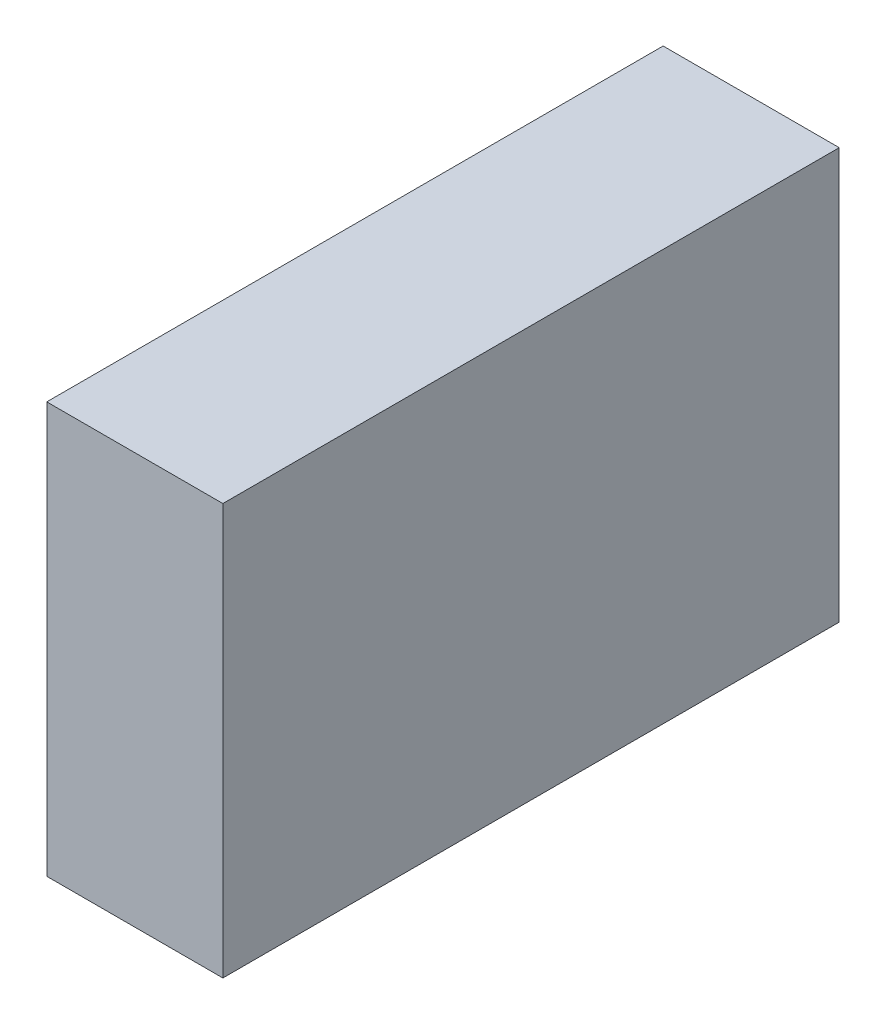
ISO-10303-21;
HEADER;
FILE_DESCRIPTION(('STEP AP214'),'2;1');
FILE_NAME('part.step','',(''),(''),'','','');
FILE_SCHEMA(('AUTOMOTIVE_DESIGN { 1 0 10303 214 1 1 1 1 }'));
ENDSEC;
DATA;
#1=APPLICATION_CONTEXT('core data for automotive mechanical design processes');
#2=APPLICATION_PROTOCOL_DEFINITION('international standard','automotive_design',2000,#1);
#3=PRODUCT_CONTEXT('',#1,'mechanical');
#4=PRODUCT('Part','Part','',(#3));
#5=PRODUCT_RELATED_PRODUCT_CATEGORY('part','',(#4));
#6=PRODUCT_DEFINITION_FORMATION('','',#4);
#7=PRODUCT_DEFINITION_CONTEXT('part definition',#1,'design');
#8=PRODUCT_DEFINITION('design','',#6,#7);
#9=PRODUCT_DEFINITION_SHAPE('','',#8);
#10=(LENGTH_UNIT() NAMED_UNIT(*) SI_UNIT(.MILLI.,.METRE.));
#11=(NAMED_UNIT(*) PLANE_ANGLE_UNIT() SI_UNIT($,.RADIAN.));
#12=(NAMED_UNIT(*) SI_UNIT($,.STERADIAN.) SOLID_ANGLE_UNIT());
#13=UNCERTAINTY_MEASURE_WITH_UNIT(LENGTH_MEASURE(1.E-05),#10,'distance_accuracy_value','');
#14=(GEOMETRIC_REPRESENTATION_CONTEXT(3) GLOBAL_UNCERTAINTY_ASSIGNED_CONTEXT((#13)) GLOBAL_UNIT_ASSIGNED_CONTEXT((#10,
#11,#12)) REPRESENTATION_CONTEXT('',''));
#15=CARTESIAN_POINT('',(0.,0.,0.));
#16=DIRECTION('',(0.,0.,1.));
#17=DIRECTION('',(1.,0.,0.));
#18=AXIS2_PLACEMENT_3D('',#15,#16,#17);
#19=CARTESIAN_POINT('',(0.,0.,95.));
#20=DIRECTION('',(0.,0.,-1.));
#21=DIRECTION('',(-1.,0.,0.));
#22=AXIS2_PLACEMENT_3D('',#19,#20,#21);
#23=PLANE('',#22);
#24=DIRECTION('',(0.,1.,0.));
#25=VECTOR('',#24,1.);
#26=CARTESIAN_POINT('',(0.,0.,95.));
#27=LINE('',#26,#25);
#28=CARTESIAN_POINT('',(0.,0.0749999999999983,95.));
#29=VERTEX_POINT('',#28);
#30=CARTESIAN_POINT('',(0.,-0.0749999999999976,95.));
#31=VERTEX_POINT('',#30);
#32=EDGE_CURVE('E125',#29,#31,#27,.F.);
#33=ORIENTED_EDGE('',*,*,#32,.F.);
#34=CARTESIAN_POINT('',(0.,0.,95.));
#35=DIRECTION('',(0.,0.,-1.));
#36=DIRECTION('',(-1.,0.,0.));
#37=AXIS2_PLACEMENT_3D('',#34,#35,#36);
#38=CIRCLE('',#37,0.0749999999999983);
#39=EDGE_CURVE('E21',#31,#29,#38,.F.);
#40=ORIENTED_EDGE('',*,*,#39,.F.);
#41=EDGE_LOOP('',(#33,#40));
#42=FACE_BOUND('',#41,.T.);
#43=ADVANCED_FACE('F17',(#42),#23,.T.);
#44=CARTESIAN_POINT('',(0.,0.,85.1));
#45=DIRECTION('',(0.,0.,-1.));
#46=DIRECTION('',(-1.,0.,0.));
#47=AXIS2_PLACEMENT_3D('',#44,#45,#46);
#48=DEGENERATE_TOROIDAL_SURFACE('',#47,0.0749999999999977,9.90000000000001,.T.);
#49=CARTESIAN_POINT('',(0.,0.074999999999998,85.1));
#50=DIRECTION('',(-1.,0.,0.));
#51=DIRECTION('',(0.,-1.,0.));
#52=AXIS2_PLACEMENT_3D('',#49,#50,#51);
#53=CIRCLE('',#52,9.90000000000001);
#54=CARTESIAN_POINT('',(0.,9.57900000000001,87.872));
#55=VERTEX_POINT('',#54);
#56=EDGE_CURVE('E119',#55,#29,#53,.F.);
#57=ORIENTED_EDGE('',*,*,#56,.F.);
#58=CARTESIAN_POINT('',(0.,0.,87.872));
#59=DIRECTION('',(0.,0.,-1.));
#60=DIRECTION('',(1.,0.,0.));
#61=AXIS2_PLACEMENT_3D('',#58,#59,#60);
#62=CIRCLE('',#61,9.579);
#63=CARTESIAN_POINT('',(0.,-9.579,87.872));
#64=VERTEX_POINT('',#63);
#65=EDGE_CURVE('E124',#55,#64,#62,.T.);
#66=ORIENTED_EDGE('',*,*,#65,.T.);
#67=CARTESIAN_POINT('',(0.,-0.0749999999999973,85.1));
#68=DIRECTION('',(1.,0.,0.));
#69=DIRECTION('',(0.,1.,0.));
#70=AXIS2_PLACEMENT_3D('',#67,#68,#69);
#71=CIRCLE('',#70,9.90000000000001);
#72=EDGE_CURVE('E122',#31,#64,#71,.T.);
#73=ORIENTED_EDGE('',*,*,#72,.F.);
#74=ORIENTED_EDGE('',*,*,#39,.T.);
#75=EDGE_LOOP('',(#57,#66,#73,#74));
#76=FACE_BOUND('',#75,.T.);
#77=ADVANCED_FACE('F117',(#76),#48,.F.);
#78=CARTESIAN_POINT('',(0.,0.,46.7451428115925));
#79=DIRECTION('',(0.,0.,-1.));
#80=DIRECTION('',(-1.,0.,0.));
#81=AXIS2_PLACEMENT_3D('',#78,#79,#80);
#82=CONICAL_SURFACE('',#81,21.5743333466189,0.283794109208328);
#83=ORIENTED_EDGE('',*,*,#65,.F.);
#84=DIRECTION('',(0.,-0.279999999999999,0.960000000000001));
#85=VECTOR('',#84,1.);
#86=CARTESIAN_POINT('',(0.,21.5743333466188,46.7451428115925));
#87=LINE('',#86,#85);
#88=CARTESIAN_POINT('',(0.,21.5743333466188,46.7451428115925));
#89=VERTEX_POINT('',#88);
#90=EDGE_CURVE('E132',#89,#55,#87,.T.);
#91=ORIENTED_EDGE('',*,*,#90,.F.);
#92=CARTESIAN_POINT('',(0.,0.,46.7451428115925));
#93=DIRECTION('',(0.,0.,-1.));
#94=DIRECTION('',(1.,0.,0.));
#95=AXIS2_PLACEMENT_3D('',#92,#93,#94);
#96=CIRCLE('',#95,21.5743333466188);
#97=CARTESIAN_POINT('',(0.,-21.5743333466188,46.7451428115925));
#98=VERTEX_POINT('',#97);
#99=EDGE_CURVE('E458',#89,#98,#96,.T.);
#100=ORIENTED_EDGE('',*,*,#99,.T.);
#101=DIRECTION('',(0.,-0.279999999999999,-0.960000000000001));
#102=VECTOR('',#101,1.);
#103=CARTESIAN_POINT('',(0.,-9.579,87.872));
#104=LINE('',#103,#102);
#105=EDGE_CURVE('E321',#64,#98,#104,.T.);
#106=ORIENTED_EDGE('',*,*,#105,.F.);
#107=EDGE_LOOP('',(#83,#91,#100,#106));
#108=FACE_BOUND('',#107,.T.);
#109=ADVANCED_FACE('F244',(#108),#82,.F.);
#110=CARTESIAN_POINT('',(0.,0.,43.9451428115925));
#111=DIRECTION('',(0.,0.,-1.));
#112=DIRECTION('',(1.,0.,0.));
#113=AXIS2_PLACEMENT_3D('',#110,#111,#112);
#114=TOROIDAL_SURFACE('',#113,11.9743333466188,10.);
#115=ORIENTED_EDGE('',*,*,#99,.F.);
#116=CARTESIAN_POINT('',(0.,15.6581111155396,34.6483809371975));
#117=CARTESIAN_POINT('',(0.,15.9195968283825,34.7519603203659));
#118=CARTESIAN_POINT('',(0.,16.1766856918784,34.8666242387304));
#119=CARTESIAN_POINT('',(0.,16.680287629009,35.1171800705973));
#120=CARTESIAN_POINT('',(0.,16.9268012082155,35.2530709678586));
#121=CARTESIAN_POINT('',(0.,17.4073265189603,35.5450468849546));
#122=CARTESIAN_POINT('',(0.,17.641346936224,35.7011176097067));
#123=CARTESIAN_POINT('',(0.,18.095411747219,36.0324082136067));
#124=CARTESIAN_POINT('',(0.,18.3154563115301,36.2076278589646));
#125=CARTESIAN_POINT('',(0.,18.7401109929584,36.5760646212188));
#126=CARTESIAN_POINT('',(0.,18.9447135871878,36.7692904090625));
#127=CARTESIAN_POINT('',(0.,19.3369159398995,37.1722971959028));
#128=CARTESIAN_POINT('',(0.,19.5245153391076,37.3820785445399));
#129=CARTESIAN_POINT('',(0.,19.8813277852951,37.8166470176979));
#130=CARTESIAN_POINT('',(0.,20.0505454042209,38.0414303883333));
#131=CARTESIAN_POINT('',(0.,20.3694442508555,38.5044504515763));
#132=CARTESIAN_POINT('',(0.,20.5191256000658,38.7426870605012));
#133=CARTESIAN_POINT('',(0.,20.7978777158438,39.2309013825695));
#134=CARTESIAN_POINT('',(0.,20.9269501843811,39.4808781239536));
#135=CARTESIAN_POINT('',(0.,21.1635822458065,39.9908145299473));
#136=CARTESIAN_POINT('',(0.,21.2711418342081,40.250774196639));
#137=CARTESIAN_POINT('',(0.,21.4640249409851,40.7789418667299));
#138=CARTESIAN_POINT('',(0.,21.5493389459349,41.0471533444159));
#139=CARTESIAN_POINT('',(0.,21.697061752905,41.589803596011));
#140=CARTESIAN_POINT('',(0.,21.7594711894468,41.8642421971874));
#141=CARTESIAN_POINT('',(0.,21.8609700455238,42.4175414653477));
#142=CARTESIAN_POINT('',(0.,21.9000476740209,42.6964042952226));
#143=CARTESIAN_POINT('',(0.,21.9545544733446,43.256425858476));
#144=CARTESIAN_POINT('',(0.,21.9699842336994,43.5375845344447));
#145=CARTESIAN_POINT('',(0.,21.9770843989937,44.0998771222639));
#146=CARTESIAN_POINT('',(0.,21.968781796845,44.3810106988376));
#147=CARTESIAN_POINT('',(0.,21.9285391473477,44.9414737936074));
#148=CARTESIAN_POINT('',(0.,21.8966095235859,45.2208040525773));
#149=CARTESIAN_POINT('',(0.,21.8198629467652,45.7089580803511));
#150=CARTESIAN_POINT('',(0.,21.7799958093889,45.9185739965827));
#151=CARTESIAN_POINT('',(0.,21.6870305237953,46.3344672905062));
#152=CARTESIAN_POINT('',(0.,21.6339555507114,46.5407498489578));
#153=CARTESIAN_POINT('',(0.,21.5743333466188,46.7451428115925));
#154=B_SPLINE_CURVE_WITH_KNOTS('',3,(#116,#117,#118,#119,#120,#121,#122,#123,#124,#125,#126,
#127,#128,#129,#130,#131,#132,#133,#134,#135,#136,#137,#138,#139,#140,#141,#142,#143,#144,#145,
#146,#147,#148,#149,#150,#151,#152,#153),.UNSPECIFIED.,.F.,.F.,(4,2,2,2,2,2,2,2,2,2,2,2,2,2,2,2,
2,2,4),(0.,0.843502608802614,1.68696484730751,2.52983283034858,3.37269052393501,
4.21595621820343,5.05923972635237,5.90231300907248,6.74538104823216,7.58837942717383,
8.43137798192628,9.27473645978017,10.118071572445,10.9618325157312,11.8055724241862,
12.6483530547151,13.4907620953032,14.130464540875,14.7690523504703),.UNSPECIFIED.);
#155=CARTESIAN_POINT('',(0.,15.6581111155396,34.6483809371975));
#156=VERTEX_POINT('',#155);
#157=EDGE_CURVE('E134',#156,#89,#154,.T.);
#158=ORIENTED_EDGE('',*,*,#157,.F.);
#159=CARTESIAN_POINT('',(0.,0.,34.6483809371975));
#160=DIRECTION('',(0.,0.,1.));
#161=DIRECTION('',(1.,0.,0.));
#162=AXIS2_PLACEMENT_3D('',#159,#160,#161);
#163=CIRCLE('',#162,15.6581111155396);
#164=CARTESIAN_POINT('',(0.,-15.6581111155396,34.6483809371975));
#165=VERTEX_POINT('',#164);
#166=EDGE_CURVE('E230',#165,#156,#163,.T.);
#167=ORIENTED_EDGE('',*,*,#166,.F.);
#168=CARTESIAN_POINT('',(0.,-21.5743333466188,46.7451428115925));
#169=CARTESIAN_POINT('',(0.,-21.6531133239588,46.4751480305155));
#170=CARTESIAN_POINT('',(0.,-21.7204443425734,46.2018185007522));
#171=CARTESIAN_POINT('',(0.,-21.8318571754244,45.6504744007199));
#172=CARTESIAN_POINT('',(0.,-21.8759401022207,45.3724600553046));
#173=CARTESIAN_POINT('',(0.,-21.9404903248421,44.8139013930407));
#174=CARTESIAN_POINT('',(0.,-21.960974237014,44.5333589966671));
#175=CARTESIAN_POINT('',(0.,-21.978246195864,43.9715494237211));
#176=CARTESIAN_POINT('',(0.,-21.9750345318102,43.6902822560385));
#177=CARTESIAN_POINT('',(0.,-21.9449290093063,43.1288814155028));
#178=CARTESIAN_POINT('',(0.,-21.9180236878094,42.8487483572459));
#179=CARTESIAN_POINT('',(0.,-21.8407063737951,42.2917392113017));
#180=CARTESIAN_POINT('',(0.,-21.7902938847142,42.0148631925426));
#181=CARTESIAN_POINT('',(0.,-21.6663358592682,41.4664114740251));
#182=CARTESIAN_POINT('',(0.,-21.5927960929636,41.1948344701367));
#183=CARTESIAN_POINT('',(0.,-21.4231028635258,40.658841689184));
#184=CARTESIAN_POINT('',(0.,-21.3269495410431,40.3944258675904));
#185=CARTESIAN_POINT('',(0.,-21.1127212249961,39.8746545766105));
#186=CARTESIAN_POINT('',(0.,-20.994648043411,39.6192983603993));
#187=CARTESIAN_POINT('',(0.,-20.7374138530614,39.1194379379137));
#188=CARTESIAN_POINT('',(0.,-20.5982528398989,38.8749337339026));
#189=CARTESIAN_POINT('',(0.,-20.2997681641159,38.3984131373572));
#190=CARTESIAN_POINT('',(0.,-20.1404359183036,38.1664021211371));
#191=CARTESIAN_POINT('',(0.,-19.8027932566294,37.7166368976339));
#192=CARTESIAN_POINT('',(0.,-19.6244833666787,37.498882295545));
#193=CARTESIAN_POINT('',(0.,-19.2500556874425,37.0790656558635));
#194=CARTESIAN_POINT('',(0.,-19.0539289517619,36.8770115975374));
#195=CARTESIAN_POINT('',(0.,-18.6453442063658,36.4901606594347));
#196=CARTESIAN_POINT('',(0.,-18.4328866039084,36.3053633495648));
#197=CARTESIAN_POINT('',(0.,-17.9934038426505,35.9545382232972));
#198=CARTESIAN_POINT('',(0.,-17.7663955208506,35.7884893060674));
#199=CARTESIAN_POINT('',(0.,-17.2992906420413,35.476157137327));
#200=CARTESIAN_POINT('',(0.,-17.0591998998891,35.3298652032276));
#201=CARTESIAN_POINT('',(0.,-16.6267600440294,35.0907414633993));
#202=CARTESIAN_POINT('',(0.,-16.4368246032374,34.9935162130198));
#203=CARTESIAN_POINT('',(0.,-16.0514657693444,34.8115592252542));
#204=CARTESIAN_POINT('',(0.,-15.8560525152647,34.7268060139926));
#205=CARTESIAN_POINT('',(0.,-15.6581111155396,34.6483809371975));
#206=B_SPLINE_CURVE_WITH_KNOTS('',3,(#168,#169,#170,#171,#172,#173,#174,#175,#176,#177,#178,
#179,#180,#181,#182,#183,#184,#185,#186,#187,#188,#189,#190,#191,#192,#193,#194,#195,#196,#197,
#198,#199,#200,#201,#202,#203,#204,#205),.UNSPECIFIED.,.F.,.F.,(4,2,2,2,2,2,2,2,2,2,2,2,2,2,2,2,
2,2,4),(0.,0.843502608802622,1.68696484730752,2.52983283034857,3.37269052393501,
4.21595621820343,5.05923972635237,5.90231300907249,6.74538104823216,7.58837942717382,
8.43137798192627,9.27473645978018,10.118071572445,10.9618325157312,11.8055724241862,
12.6483530547151,13.4907620953032,14.130464540875,14.7690523504703),.UNSPECIFIED.);
#207=EDGE_CURVE('E195',#98,#165,#206,.T.);
#208=ORIENTED_EDGE('',*,*,#207,.F.);
#209=EDGE_LOOP('',(#115,#158,#167,#208));
#210=FACE_BOUND('',#209,.T.);
#211=ADVANCED_FACE('F153',(#210),#114,.F.);
#212=CARTESIAN_POINT('',(0.,0.,30.));
#213=DIRECTION('',(0.,0.,1.));
#214=DIRECTION('',(1.,0.,0.));
#215=AXIS2_PLACEMENT_3D('',#212,#213,#214);
#216=TOROIDAL_SURFACE('',#215,17.5,5.);
#217=CARTESIAN_POINT('',(0.,12.5,30.));
#218=CARTESIAN_POINT('',(0.,12.4999848789469,30.1406280260115));
#219=CARTESIAN_POINT('',(0.,12.5059322378173,30.2812538799012));
#220=CARTESIAN_POINT('',(0.,12.5296427162452,30.5614996473747));
#221=CARTESIAN_POINT('',(0.,12.5474052835465,30.7011196076666));
#222=CARTESIAN_POINT('',(0.,12.5946198890351,30.9782648916681));
#223=CARTESIAN_POINT('',(0.,12.6240634489387,31.1157916596455));
#224=CARTESIAN_POINT('',(0.,12.6944257910108,31.3878755313183));
#225=CARTESIAN_POINT('',(0.,12.7353444166466,31.5224326754958));
#226=CARTESIAN_POINT('',(0.,12.8283783503133,31.7876537255822));
#227=CARTESIAN_POINT('',(0.,12.8804962309564,31.9183167290909));
#228=CARTESIAN_POINT('',(0.,12.9955724137892,32.174833234794));
#229=CARTESIAN_POINT('',(0.,13.0585344819135,32.300685047558));
#230=CARTESIAN_POINT('',(0.,13.1948242963772,32.5466098000423));
#231=CARTESIAN_POINT('',(0.,13.2681498309163,32.6666839655337));
#232=CARTESIAN_POINT('',(0.,13.4246553676385,32.9002285118493));
#233=CARTESIAN_POINT('',(0.,13.5078353717113,33.0136988914072));
#234=CARTESIAN_POINT('',(0.,13.6835052122624,33.2332874324052));
#235=CARTESIAN_POINT('',(0.,13.7759999615649,33.339401663693));
#236=CARTESIAN_POINT('',(0.,13.9695703751536,33.5434211774498));
#237=CARTESIAN_POINT('',(0.,14.0706430535256,33.6413292930118));
#238=CARTESIAN_POINT('',(0.,14.2806435856645,33.8282497211688));
#239=CARTESIAN_POINT('',(0.,14.3895687662667,33.9172650366794));
#240=CARTESIAN_POINT('',(0.,14.6144899815324,34.0857774159718));
#241=CARTESIAN_POINT('',(0.,14.7304837083672,34.1652775615259));
#242=CARTESIAN_POINT('',(0.,14.9779448006042,34.3199676210708));
#243=CARTESIAN_POINT('',(0.,15.1099157816714,34.3943534082574));
#244=CARTESIAN_POINT('',(0.,15.3797915247996,34.5307381700344));
#245=CARTESIAN_POINT('',(0.,15.5176844205897,34.5927606284997));
#246=CARTESIAN_POINT('',(0.,15.6581111155396,34.6483809371975));
#247=B_SPLINE_CURVE_WITH_KNOTS('',3,(#217,#218,#219,#220,#221,#222,#223,#224,#225,#226,#227,
#228,#229,#230,#231,#232,#233,#234,#235,#236,#237,#238,#239,#240,#241,#242,#243,#244,#245,#246),
.UNSPECIFIED.,.F.,.F.,(4,2,2,2,2,2,2,2,2,2,2,2,2,2,4),(0.,0.42175530917628,0.843490906418767,
1.26492095843873,1.68634526195626,2.10786647571107,2.52953437025293,2.95111240675678,
3.3726905241036,3.79449216828968,4.21614758393561,4.63766013050088,5.05903578606103,
5.51287982887678,5.9658534133287),.UNSPECIFIED.);
#248=CARTESIAN_POINT('',(0.,12.5,30.));
#249=VERTEX_POINT('',#248);
#250=EDGE_CURVE('E146',#249,#156,#247,.T.);
#251=ORIENTED_EDGE('',*,*,#250,.F.);
#252=CARTESIAN_POINT('',(0.,0.,30.));
#253=DIRECTION('',(0.,0.,1.));
#254=DIRECTION('',(1.,0.,0.));
#255=AXIS2_PLACEMENT_3D('',#252,#253,#254);
#256=CIRCLE('',#255,12.5);
#257=CARTESIAN_POINT('',(0.,-12.5,30.));
#258=VERTEX_POINT('',#257);
#259=EDGE_CURVE('E228',#249,#258,#256,.F.);
#260=ORIENTED_EDGE('',*,*,#259,.T.);
#261=CARTESIAN_POINT('',(0.,-15.6581111155396,34.6483809371975));
#262=CARTESIAN_POINT('',(0.,-15.5273670182102,34.5965907552897));
#263=CARTESIAN_POINT('',(0.,-15.3988213853495,34.5392581979403));
#264=CARTESIAN_POINT('',(0.,-15.1470179820311,34.4139788179478));
#265=CARTESIAN_POINT('',(0.,-15.0237599647109,34.3460324915178));
#266=CARTESIAN_POINT('',(0.,-14.7834974051202,34.2000440334991));
#267=CARTESIAN_POINT('',(0.,-14.6664883969372,34.1220092519327));
#268=CARTESIAN_POINT('',(0.,-14.4394584236061,33.9563654062407));
#269=CARTESIAN_POINT('',(0.,-14.3294373631595,33.8687564727273));
#270=CARTESIAN_POINT('',(0.,-14.1171393021462,33.6845634991578));
#271=CARTESIAN_POINT('',(0.,-14.0148640882124,33.5879773998295));
#272=CARTESIAN_POINT('',(0.,-13.8187783095803,33.3864988328014));
#273=CARTESIAN_POINT('',(0.,-13.7249707027917,33.2816034863504));
#274=CARTESIAN_POINT('',(0.,-13.5465464553702,33.06430487765));
#275=CARTESIAN_POINT('',(0.,-13.4619278603892,32.9519032201119));
#276=CARTESIAN_POINT('',(0.,-13.3024602186622,32.7203711286418));
#277=CARTESIAN_POINT('',(0.,-13.2276111737897,32.6012406934196));
#278=CARTESIAN_POINT('',(0.,-13.0881778015185,32.357033087244));
#279=CARTESIAN_POINT('',(0.,-13.023598937664,32.231952796736));
#280=CARTESIAN_POINT('',(0.,-12.9052338925813,31.9768387377094));
#281=CARTESIAN_POINT('',(0.,-12.8514439775493,31.8468067014758));
#282=CARTESIAN_POINT('',(0.,-12.7550280357212,31.5827168756164));
#283=CARTESIAN_POINT('',(0.,-12.7123982324514,31.4486604649609));
#284=CARTESIAN_POINT('',(0.,-12.63859226339,31.1774803514158));
#285=CARTESIAN_POINT('',(0.,-12.6074123823952,31.0403576588034));
#286=CARTESIAN_POINT('',(0.,-12.5547598846283,30.7533145937904));
#287=CARTESIAN_POINT('',(0.,-12.5342203662168,30.6032222443431));
#288=CARTESIAN_POINT('',(0.,-12.5068429271537,30.3020840770439));
#289=CARTESIAN_POINT('',(0.,-12.4999788028324,30.1510406400439));
#290=CARTESIAN_POINT('',(0.,-12.5,30.));
#291=B_SPLINE_CURVE_WITH_KNOTS('',3,(#261,#262,#263,#264,#265,#266,#267,#268,#269,#270,#271,
#272,#273,#274,#275,#276,#277,#278,#279,#280,#281,#282,#283,#284,#285,#286,#287,#288,#289,#290),
.UNSPECIFIED.,.F.,.F.,(4,2,2,2,2,2,2,2,2,2,2,2,2,2,4),(0.,0.421755309176284,0.843490906418768,
1.26492095843874,1.68634526195627,2.10786647571107,2.52953437025293,2.95111240675679,
3.37269052410361,3.79449216828969,4.21614758393562,4.63766013050088,5.05903578606103,
5.51287982887678,5.9658534133287),.UNSPECIFIED.);
#292=EDGE_CURVE('E189',#165,#258,#291,.T.);
#293=ORIENTED_EDGE('',*,*,#292,.F.);
#294=ORIENTED_EDGE('',*,*,#166,.T.);
#295=EDGE_LOOP('',(#251,#260,#293,#294));
#296=FACE_BOUND('',#295,.T.);
#297=ADVANCED_FACE('F233',(#296),#216,.T.);
#298=CARTESIAN_POINT('',(0.,0.,15.));
#299=DIRECTION('',(0.,0.,1.));
#300=DIRECTION('',(1.,0.,0.));
#301=AXIS2_PLACEMENT_3D('',#298,#299,#300);
#302=CYLINDRICAL_SURFACE('',#301,12.5);
#303=ORIENTED_EDGE('',*,*,#259,.F.);
#304=DIRECTION('',(0.,0.,1.));
#305=VECTOR('',#304,1.);
#306=CARTESIAN_POINT('',(0.,12.5,47.5));
#307=LINE('',#306,#305);
#308=CARTESIAN_POINT('',(0.,12.5,22.9843597113357));
#309=VERTEX_POINT('',#308);
#310=EDGE_CURVE('E208',#309,#249,#307,.T.);
#311=ORIENTED_EDGE('',*,*,#310,.F.);
#312=CARTESIAN_POINT('',(0.,0.,22.9843597113357));
#313=DIRECTION('',(0.,0.,-1.));
#314=DIRECTION('',(1.,0.,0.));
#315=AXIS2_PLACEMENT_3D('',#312,#313,#314);
#316=CIRCLE('',#315,12.5);
#317=CARTESIAN_POINT('',(0.,-12.5,22.9843597113357));
#318=VERTEX_POINT('',#317);
#319=EDGE_CURVE('E226',#318,#309,#316,.F.);
#320=ORIENTED_EDGE('',*,*,#319,.F.);
#321=DIRECTION('',(0.,0.,1.));
#322=VECTOR('',#321,1.);
#323=CARTESIAN_POINT('',(0.,-12.5,47.5));
#324=LINE('',#323,#322);
#325=EDGE_CURVE('E318',#258,#318,#324,.F.);
#326=ORIENTED_EDGE('',*,*,#325,.F.);
#327=EDGE_LOOP('',(#303,#311,#320,#326));
#328=FACE_BOUND('',#327,.T.);
#329=ADVANCED_FACE('F217',(#328),#302,.F.);
#330=CARTESIAN_POINT('',(0.,0.,22.9843597113357));
#331=DIRECTION('',(0.,0.,-1.));
#332=DIRECTION('',(1.,0.,0.));
#333=AXIS2_PLACEMENT_3D('',#330,#331,#332);
#334=TOROIDAL_SURFACE('',#333,20.5,8.);
#335=CARTESIAN_POINT('',(0.,15.8333333333334,16.4864968147964));
#336=CARTESIAN_POINT('',(0.,15.6505363473192,16.6177490267966));
#337=CARTESIAN_POINT('',(0.,15.473308772315,16.7567501768617));
#338=CARTESIAN_POINT('',(0.,15.1311913280324,17.0491742609203));
#339=CARTESIAN_POINT('',(0.,14.9663009824314,17.2025966376145));
#340=CARTESIAN_POINT('',(0.,14.6502042049924,17.5226337425984));
#341=CARTESIAN_POINT('',(0.,14.4989839584929,17.6892348261075));
#342=CARTESIAN_POINT('',(0.,14.2111102707254,18.0345728768037));
#343=CARTESIAN_POINT('',(0.,14.0744564921971,18.2133095628555));
#344=CARTESIAN_POINT('',(0.,13.8165844517793,18.5817959317664));
#345=CARTESIAN_POINT('',(0.,13.6953781381041,18.7715539761994));
#346=CARTESIAN_POINT('',(0.,13.4693840855021,19.160611727955));
#347=CARTESIAN_POINT('',(0.,13.3645965766925,19.3599115689592));
#348=CARTESIAN_POINT('',(0.,13.1722279586232,19.7665454001583));
#349=CARTESIAN_POINT('',(0.,13.0846397939735,19.9738760540483));
#350=CARTESIAN_POINT('',(0.,12.9272466897319,20.3951600538228));
#351=CARTESIAN_POINT('',(0.,12.8574392619383,20.6091124683663));
#352=CARTESIAN_POINT('',(0.,12.7476106883996,21.0010146005929));
#353=CARTESIAN_POINT('',(0.,12.7044510254641,21.1780925837795));
#354=CARTESIAN_POINT('',(0.,12.6303185746371,21.5347772541328));
#355=CARTESIAN_POINT('',(0.,12.5993449986897,21.7143837770043));
#356=CARTESIAN_POINT('',(0.,12.5497334199464,22.0752796521917));
#357=CARTESIAN_POINT('',(0.,12.5310946871083,22.2565689042706));
#358=CARTESIAN_POINT('',(0.,12.5062219276056,22.6200245387899));
#359=CARTESIAN_POINT('',(0.,12.4999898310241,22.8021910532867));
#360=CARTESIAN_POINT('',(0.,12.5,22.9843597113357));
#361=B_SPLINE_CURVE_WITH_KNOTS('',3,(#335,#336,#337,#338,#339,#340,#341,#342,#343,#344,#345,
#346,#347,#348,#349,#350,#351,#352,#353,#354,#355,#356,#357,#358,#359,#360),.UNSPECIFIED.,.F.,
.F.,(4,2,2,2,2,2,2,2,2,2,2,2,4),(0.,0.674906473542293,1.34978687645971,2.02397745416591,
2.69815241880583,3.3728457158484,4.04754846818561,4.72197386800985,5.39630483813788,
5.94268335445205,6.48902653147419,7.03533737008726,7.58173319088163),.UNSPECIFIED.);
#362=CARTESIAN_POINT('',(0.,15.8333333333333,16.4864968147963));
#363=VERTEX_POINT('',#362);
#364=EDGE_CURVE('E201',#363,#309,#361,.T.);
#365=ORIENTED_EDGE('',*,*,#364,.F.);
#366=CARTESIAN_POINT('',(0.,0.,16.4864968147963));
#367=DIRECTION('',(0.,0.,1.));
#368=DIRECTION('',(0.,-1.,0.));
#369=AXIS2_PLACEMENT_3D('',#366,#367,#368);
#370=CIRCLE('',#369,15.8333333333333);
#371=CARTESIAN_POINT('',(0.,-15.8333333333333,16.4864968147963));
#372=VERTEX_POINT('',#371);
#373=EDGE_CURVE('E224',#372,#363,#370,.T.);
#374=ORIENTED_EDGE('',*,*,#373,.F.);
#375=CARTESIAN_POINT('',(0.,-12.5,22.9843597113357));
#376=CARTESIAN_POINT('',(0.,-12.4999757846307,22.7593222018747));
#377=CARTESIAN_POINT('',(0.,-12.509494334493,22.5342881371871));
#378=CARTESIAN_POINT('',(0.,-12.5474422760605,22.0858283905534));
#379=CARTESIAN_POINT('',(0.,-12.5758709372541,21.8624026468137));
#380=CARTESIAN_POINT('',(0.,-12.6514258041635,21.4189701453435));
#381=CARTESIAN_POINT('',(0.,-12.6985328685876,21.1989601263463));
#382=CARTESIAN_POINT('',(0.,-12.8111014640209,20.7636924607776));
#383=CARTESIAN_POINT('',(0.,-12.8765625699478,20.5484347042676));
#384=CARTESIAN_POINT('',(0.,-13.0254339510907,20.1240321769673));
#385=CARTESIAN_POINT('',(0.,-13.1088579876437,19.9148922333243));
#386=CARTESIAN_POINT('',(0.,-13.2930336148438,19.5043820819784));
#387=CARTESIAN_POINT('',(0.,-13.3937854483066,19.3030119832033));
#388=CARTESIAN_POINT('',(0.,-13.6118517816278,18.9095608017775));
#389=CARTESIAN_POINT('',(0.,-13.7291594559854,18.7174759346849));
#390=CARTESIAN_POINT('',(0.,-13.9795275207246,18.3438870832887));
#391=CARTESIAN_POINT('',(0.,-14.1125857031893,18.1623816212679));
#392=CARTESIAN_POINT('',(0.,-14.3668348258004,17.8445656675136));
#393=CARTESIAN_POINT('',(0.,-14.4854869128475,17.7062144807695));
#394=CARTESIAN_POINT('',(0.,-14.731953993855,17.4379356103562));
#395=CARTESIAN_POINT('',(0.,-14.8597683946703,17.3080073824409));
#396=CARTESIAN_POINT('',(0.,-15.1239597966818,17.0571886339871));
#397=CARTESIAN_POINT('',(0.,-15.2603362906044,16.9362975789561));
#398=CARTESIAN_POINT('',(0.,-15.5410377911545,16.7040793195148));
#399=CARTESIAN_POINT('',(0.,-15.6853640309247,16.5927536057486));
#400=CARTESIAN_POINT('',(0.,-15.8333333333333,16.4864968147964));
#401=B_SPLINE_CURVE_WITH_KNOTS('',3,(#375,#376,#377,#378,#379,#380,#381,#382,#383,#384,#385,
#386,#387,#388,#389,#390,#391,#392,#393,#394,#395,#396,#397,#398,#399,#400),.UNSPECIFIED.,.F.,
.F.,(4,2,2,2,2,2,2,2,2,2,2,2,4),(0.,0.674906473542293,1.34978687645972,2.02397745416592,
2.69815241880583,3.3728457158484,4.0475484681856,4.72197386800984,5.39630483813787,
5.94268335445204,6.48902653147419,7.03533737008725,7.58173319088161),.UNSPECIFIED.);
#402=EDGE_CURVE('E181',#318,#372,#401,.T.);
#403=ORIENTED_EDGE('',*,*,#402,.F.);
#404=ORIENTED_EDGE('',*,*,#319,.T.);
#405=EDGE_LOOP('',(#365,#374,#403,#404));
#406=FACE_BOUND('',#405,.T.);
#407=ADVANCED_FACE('F211',(#406),#334,.T.);
#408=CARTESIAN_POINT('',(0.,0.,8.36416819412222));
#409=DIRECTION('',(0.,0.,1.));
#410=DIRECTION('',(1.,0.,0.));
#411=AXIS2_PLACEMENT_3D('',#408,#409,#410);
#412=TOROIDAL_SURFACE('',#411,10.0000000000002,9.99999999999982);
#413=CARTESIAN_POINT('',(0.,10.0000000000002,8.36416819412222));
#414=DIRECTION('',(1.,0.,0.));
#415=DIRECTION('',(0.,1.,0.));
#416=AXIS2_PLACEMENT_3D('',#413,#414,#415);
#417=CIRCLE('',#416,9.99999999999982);
#418=CARTESIAN_POINT('',(0.,20.,8.36416819412221));
#419=VERTEX_POINT('',#418);
#420=EDGE_CURVE('E209',#419,#363,#417,.T.);
#421=ORIENTED_EDGE('',*,*,#420,.F.);
#422=CARTESIAN_POINT('',(0.,0.,8.36416819412221));
#423=DIRECTION('',(0.,0.,1.));
#424=DIRECTION('',(1.,0.,0.));
#425=AXIS2_PLACEMENT_3D('',#422,#423,#424);
#426=CIRCLE('',#425,20.);
#427=CARTESIAN_POINT('',(0.,-20.,8.36416819412221));
#428=VERTEX_POINT('',#427);
#429=EDGE_CURVE('E436',#419,#428,#426,.F.);
#430=ORIENTED_EDGE('',*,*,#429,.T.);
#431=CARTESIAN_POINT('',(0.,-10.0000000000002,8.36416819412222));
#432=DIRECTION('',(-1.,0.,0.));
#433=DIRECTION('',(0.,-1.,0.));
#434=AXIS2_PLACEMENT_3D('',#431,#432,#433);
#435=CIRCLE('',#434,9.99999999999982);
#436=EDGE_CURVE('E317',#372,#428,#435,.F.);
#437=ORIENTED_EDGE('',*,*,#436,.F.);
#438=ORIENTED_EDGE('',*,*,#373,.T.);
#439=EDGE_LOOP('',(#421,#430,#437,#438));
#440=FACE_BOUND('',#439,.T.);
#441=ADVANCED_FACE('F19',(#440),#412,.F.);
#442=CARTESIAN_POINT('',(0.,0.,0.));
#443=DIRECTION('',(0.,0.,1.));
#444=DIRECTION('',(1.,0.,0.));
#445=AXIS2_PLACEMENT_3D('',#442,#443,#444);
#446=CYLINDRICAL_SURFACE('',#445,20.);
#447=ORIENTED_EDGE('',*,*,#429,.F.);
#448=DIRECTION('',(0.,0.,1.));
#449=VECTOR('',#448,1.);
#450=CARTESIAN_POINT('',(0.,20.,47.5));
#451=LINE('',#450,#449);
#452=CARTESIAN_POINT('',(0.,20.,2.5));
#453=VERTEX_POINT('',#452);
#454=EDGE_CURVE('E326',#453,#419,#451,.T.);
#455=ORIENTED_EDGE('',*,*,#454,.F.);
#456=CARTESIAN_POINT('',(0.,0.,2.5));
#457=DIRECTION('',(0.,0.,1.));
#458=DIRECTION('',(1.,0.,0.));
#459=AXIS2_PLACEMENT_3D('',#456,#457,#458);
#460=CIRCLE('',#459,20.);
#461=CARTESIAN_POINT('',(0.,-20.,2.5));
#462=VERTEX_POINT('',#461);
#463=EDGE_CURVE('E435',#453,#462,#460,.F.);
#464=ORIENTED_EDGE('',*,*,#463,.T.);
#465=DIRECTION('',(0.,0.,1.));
#466=VECTOR('',#465,1.);
#467=CARTESIAN_POINT('',(0.,-20.,47.5));
#468=LINE('',#467,#466);
#469=EDGE_CURVE('E314',#428,#462,#468,.F.);
#470=ORIENTED_EDGE('',*,*,#469,.F.);
#471=EDGE_LOOP('',(#447,#455,#464,#470));
#472=FACE_BOUND('',#471,.T.);
#473=ADVANCED_FACE('F219',(#472),#446,.F.);
#474=CARTESIAN_POINT('',(0.,0.,2.5));
#475=DIRECTION('',(0.,0.,1.));
#476=DIRECTION('',(1.,0.,0.));
#477=AXIS2_PLACEMENT_3D('',#474,#475,#476);
#478=TOROIDAL_SURFACE('',#477,17.5,2.5);
#479=ORIENTED_EDGE('',*,*,#463,.F.);
#480=CARTESIAN_POINT('',(0.,17.5,0.));
#481=CARTESIAN_POINT('',(0.,17.5703165529183,-6.73760312874608E-06));
#482=CARTESIAN_POINT('',(0.,17.6406299123009,0.00296662635220174));
#483=CARTESIAN_POINT('',(0.,17.7807535505256,0.0148214172899862));
#484=CARTESIAN_POINT('',(0.,17.8505638533379,0.023702560865375));
#485=CARTESIAN_POINT('',(0.,17.9891391507902,0.0473118570983038));
#486=CARTESIAN_POINT('',(0.,18.0579048954248,0.0620355865817941));
#487=CARTESIAN_POINT('',(0.,18.1939348460155,0.097210622779923));
#488=CARTESIAN_POINT('',(0.,18.2611990702902,0.11766185957779));
#489=CARTESIAN_POINT('',(0.,18.4600904524064,0.187441620520704));
#490=CARTESIAN_POINT('',(0.,18.5888727124231,0.245205854231468));
#491=CARTESIAN_POINT('',(0.,18.834816841989,0.381496884635308));
#492=CARTESIAN_POINT('',(0.,18.9519807536233,0.460020023738258));
#493=CARTESIAN_POINT('',(0.,19.1714822376988,0.635626131888733));
#494=CARTESIAN_POINT('',(0.,19.273819954816,0.732708919807164));
#495=CARTESIAN_POINT('',(0.,19.4607594105526,0.94269832841828));
#496=CARTESIAN_POINT('',(0.,19.5453576756194,1.05560804096441));
#497=CARTESIAN_POINT('',(0.,19.6944101921718,1.29403944841449));
#498=CARTESIAN_POINT('',(0.,19.7588604999399,1.41956360609659));
#499=CARTESIAN_POINT('',(0.,19.8657388405433,1.67962578574635));
#500=CARTESIAN_POINT('',(0.,19.9081797717814,1.81415847602264));
#501=CARTESIAN_POINT('',(0.,19.9592878258857,2.04126203816156));
#502=CARTESIAN_POINT('',(0.,19.9745456682455,2.13240425694571));
#503=CARTESIAN_POINT('',(0.,19.9949004201684,2.31568491596665));
#504=CARTESIAN_POINT('',(0.,20.0000117346551,2.40782175690097));
#505=CARTESIAN_POINT('',(0.,20.,2.49999999999996));
#506=B_SPLINE_CURVE_WITH_KNOTS('',3,(#480,#481,#482,#483,#484,#485,#486,#487,#488,#489,#490,
#491,#492,#493,#494,#495,#496,#497,#498,#499,#500,#501,#502,#503,#504,#505),.UNSPECIFIED.,.F.,
.F.,(4,2,2,2,2,2,2,2,2,2,2,2,4),(0.,0.210881056383553,0.421751997144057,0.632463600098867,
0.843172630969151,1.26442121260169,1.68559562226152,2.1067659217657,2.52801861354842,
2.94935370886886,3.37044160460489,3.64714723687037,3.92345975118444),.UNSPECIFIED.);
#507=CARTESIAN_POINT('',(0.,17.5,0.));
#508=VERTEX_POINT('',#507);
#509=EDGE_CURVE('E329',#508,#453,#506,.T.);
#510=ORIENTED_EDGE('',*,*,#509,.F.);
#511=CARTESIAN_POINT('',(0.,0.,0.));
#512=DIRECTION('',(0.,0.,-1.));
#513=DIRECTION('',(0.,1.,0.));
#514=AXIS2_PLACEMENT_3D('',#511,#512,#513);
#515=CIRCLE('',#514,17.5);
#516=CARTESIAN_POINT('',(0.,-17.5,0.));
#517=VERTEX_POINT('',#516);
#518=EDGE_CURVE('E403',#517,#508,#515,.F.);
#519=ORIENTED_EDGE('',*,*,#518,.F.);
#520=CARTESIAN_POINT('',(0.,-20.,2.5));
#521=CARTESIAN_POINT('',(0.,-20.0000067376031,2.42968344708168));
#522=CARTESIAN_POINT('',(0.,-19.9970333736478,2.35937008769911));
#523=CARTESIAN_POINT('',(0.,-19.98517858271,2.21924644947442));
#524=CARTESIAN_POINT('',(0.,-19.9762974391346,2.14943614666213));
#525=CARTESIAN_POINT('',(0.,-19.9526881429017,2.01086084920981));
#526=CARTESIAN_POINT('',(0.,-19.9379644134182,1.94209510457522));
#527=CARTESIAN_POINT('',(0.,-19.9027893772201,1.80606515398446));
#528=CARTESIAN_POINT('',(0.,-19.8823381404222,1.73880092970978));
#529=CARTESIAN_POINT('',(0.,-19.8125583794793,1.53990954759356));
#530=CARTESIAN_POINT('',(0.,-19.7547941457685,1.41112728757694));
#531=CARTESIAN_POINT('',(0.,-19.6185031153647,1.165183158011));
#532=CARTESIAN_POINT('',(0.,-19.5399799762617,1.04801924637673));
#533=CARTESIAN_POINT('',(0.,-19.3643738681113,0.82851776230125));
#534=CARTESIAN_POINT('',(0.,-19.2672910801928,0.726180045183965));
#535=CARTESIAN_POINT('',(0.,-19.0573016715817,0.539240589447368));
#536=CARTESIAN_POINT('',(0.,-18.9443919590356,0.454642324380624));
#537=CARTESIAN_POINT('',(0.,-18.7059605515855,0.305589807828165));
#538=CARTESIAN_POINT('',(0.,-18.5804363939034,0.241139500060057));
#539=CARTESIAN_POINT('',(0.,-18.3203742142537,0.134261159456687));
#540=CARTESIAN_POINT('',(0.,-18.1858415239774,0.0918202282186389));
#541=CARTESIAN_POINT('',(0.,-17.9587379618384,0.0407121741143466));
#542=CARTESIAN_POINT('',(0.,-17.8675957430543,0.0254543317545226));
#543=CARTESIAN_POINT('',(0.,-17.6843150840334,0.00509957983161923));
#544=CARTESIAN_POINT('',(0.,-17.592178243099,-1.1734655053687E-05));
#545=CARTESIAN_POINT('',(0.,-17.5,0.));
#546=B_SPLINE_CURVE_WITH_KNOTS('',3,(#520,#521,#522,#523,#524,#525,#526,#527,#528,#529,#530,
#531,#532,#533,#534,#535,#536,#537,#538,#539,#540,#541,#542,#543,#544,#545),.UNSPECIFIED.,.F.,
.F.,(4,2,2,2,2,2,2,2,2,2,2,2,4),(0.,0.210881056383553,0.421751997144058,0.63246360009887,
0.843172630969149,1.26442121260169,1.68559562226151,2.1067659217657,2.52801861354842,
2.94935370886885,3.37044160460489,3.64714723687037,3.92345975118444),.UNSPECIFIED.);
#547=EDGE_CURVE('E311',#462,#517,#546,.T.);
#548=ORIENTED_EDGE('',*,*,#547,.F.);
#549=EDGE_LOOP('',(#479,#510,#519,#548));
#550=FACE_BOUND('',#549,.T.);
#551=ADVANCED_FACE('F418',(#550),#478,.F.);
#552=CARTESIAN_POINT('',(0.,0.,0.));
#553=DIRECTION('',(0.,0.,1.));
#554=DIRECTION('',(1.,0.,0.));
#555=AXIS2_PLACEMENT_3D('',#552,#553,#554);
#556=PLANE('',#555);
#557=ORIENTED_EDGE('',*,*,#518,.T.);
#558=DIRECTION('',(0.,1.,0.));
#559=VECTOR('',#558,1.);
#560=CARTESIAN_POINT('',(0.,0.,0.));
#561=LINE('',#560,#559);
#562=CARTESIAN_POINT('',(0.,12.5,0.));
#563=VERTEX_POINT('',#562);
#564=EDGE_CURVE('E330',#563,#508,#561,.T.);
#565=ORIENTED_EDGE('',*,*,#564,.F.);
#566=CARTESIAN_POINT('',(0.,0.,0.));
#567=DIRECTION('',(0.,0.,1.));
#568=DIRECTION('',(1.,0.,0.));
#569=AXIS2_PLACEMENT_3D('',#566,#567,#568);
#570=CIRCLE('',#569,12.5);
#571=CARTESIAN_POINT('',(0.,-12.5,0.));
#572=VERTEX_POINT('',#571);
#573=EDGE_CURVE('E339',#563,#572,#570,.F.);
#574=ORIENTED_EDGE('',*,*,#573,.T.);
#575=DIRECTION('',(0.,1.,0.));
#576=VECTOR('',#575,1.);
#577=CARTESIAN_POINT('',(0.,0.,0.));
#578=LINE('',#577,#576);
#579=EDGE_CURVE('E307',#517,#572,#578,.T.);
#580=ORIENTED_EDGE('',*,*,#579,.F.);
#581=EDGE_LOOP('',(#557,#565,#574,#580));
#582=FACE_BOUND('',#581,.T.);
#583=ADVANCED_FACE('F410',(#582),#556,.T.);
#584=CARTESIAN_POINT('',(0.,30.,5.));
#585=DIRECTION('',(0.,-1.,0.));
#586=DIRECTION('',(0.,0.,-1.));
#587=AXIS2_PLACEMENT_3D('',#584,#585,#586);
#588=SPHERICAL_SURFACE('',#587,4.);
#589=CARTESIAN_POINT('',(0.,30.,5.));
#590=DIRECTION('',(1.,0.,0.));
#591=DIRECTION('',(0.,-1.,0.));
#592=AXIS2_PLACEMENT_3D('',#589,#590,#591);
#593=CIRCLE('',#592,4.);
#594=CARTESIAN_POINT('',(0.,34.,5.));
#595=VERTEX_POINT('',#594);
#596=CARTESIAN_POINT('',(0.,26.,5.));
#597=VERTEX_POINT('',#596);
#598=EDGE_CURVE('E310',#595,#597,#593,.T.);
#599=ORIENTED_EDGE('',*,*,#598,.F.);
#600=CARTESIAN_POINT('',(0.,30.,5.));
#601=DIRECTION('',(-1.,0.,0.));
#602=DIRECTION('',(0.,-1.,0.));
#603=AXIS2_PLACEMENT_3D('',#600,#601,#602);
#604=CIRCLE('',#603,4.);
#605=EDGE_CURVE('E35',#597,#595,#604,.F.);
#606=ORIENTED_EDGE('',*,*,#605,.F.);
#607=EDGE_LOOP('',(#599,#606));
#608=FACE_BOUND('',#607,.T.);
#609=ADVANCED_FACE('F390',(#608),#588,.F.);
#610=CARTESIAN_POINT('',(0.,30.,95.));
#611=DIRECTION('',(0.,-1.,0.));
#612=DIRECTION('',(0.,0.,-1.));
#613=AXIS2_PLACEMENT_3D('',#610,#611,#612);
#614=SPHERICAL_SURFACE('',#613,4.);
#615=CARTESIAN_POINT('',(0.,30.,95.));
#616=DIRECTION('',(1.,0.,0.));
#617=DIRECTION('',(0.,-1.,0.));
#618=AXIS2_PLACEMENT_3D('',#615,#616,#617);
#619=CIRCLE('',#618,4.);
#620=CARTESIAN_POINT('',(0.,34.,95.));
#621=VERTEX_POINT('',#620);
#622=CARTESIAN_POINT('',(0.,26.,95.));
#623=VERTEX_POINT('',#622);
#624=EDGE_CURVE('E467',#621,#623,#619,.T.);
#625=ORIENTED_EDGE('',*,*,#624,.F.);
#626=CARTESIAN_POINT('',(0.,30.,95.));
#627=DIRECTION('',(1.,0.,0.));
#628=DIRECTION('',(0.,-1.,0.));
#629=AXIS2_PLACEMENT_3D('',#626,#627,#628);
#630=CIRCLE('',#629,4.);
#631=EDGE_CURVE('E470',#623,#621,#630,.T.);
#632=ORIENTED_EDGE('',*,*,#631,.F.);
#633=EDGE_LOOP('',(#625,#632));
#634=FACE_BOUND('',#633,.T.);
#635=ADVANCED_FACE('F386',(#634),#614,.F.);
#636=CARTESIAN_POINT('',(0.,-30.,5.));
#637=DIRECTION('',(0.,-1.,0.));
#638=DIRECTION('',(0.,0.,-1.));
#639=AXIS2_PLACEMENT_3D('',#636,#637,#638);
#640=SPHERICAL_SURFACE('',#639,4.);
#641=CARTESIAN_POINT('',(0.,-30.,5.));
#642=DIRECTION('',(1.,0.,0.));
#643=DIRECTION('',(0.,-1.,0.));
#644=AXIS2_PLACEMENT_3D('',#641,#642,#643);
#645=CIRCLE('',#644,4.);
#646=CARTESIAN_POINT('',(0.,-26.,5.));
#647=VERTEX_POINT('',#646);
#648=CARTESIAN_POINT('',(0.,-34.,5.));
#649=VERTEX_POINT('',#648);
#650=EDGE_CURVE('E473',#647,#649,#645,.T.);
#651=ORIENTED_EDGE('',*,*,#650,.F.);
#652=CARTESIAN_POINT('',(0.,-30.,5.));
#653=DIRECTION('',(-1.,0.,0.));
#654=DIRECTION('',(0.,-1.,0.));
#655=AXIS2_PLACEMENT_3D('',#652,#653,#654);
#656=CIRCLE('',#655,4.);
#657=EDGE_CURVE('E476',#649,#647,#656,.F.);
#658=ORIENTED_EDGE('',*,*,#657,.F.);
#659=EDGE_LOOP('',(#651,#658));
#660=FACE_BOUND('',#659,.T.);
#661=ADVANCED_FACE('F382',(#660),#640,.F.);
#662=CARTESIAN_POINT('',(0.,-30.,95.));
#663=DIRECTION('',(0.,-1.,0.));
#664=DIRECTION('',(0.,0.,-1.));
#665=AXIS2_PLACEMENT_3D('',#662,#663,#664);
#666=SPHERICAL_SURFACE('',#665,4.);
#667=CARTESIAN_POINT('',(0.,-30.,95.));
#668=DIRECTION('',(1.,0.,0.));
#669=DIRECTION('',(0.,-1.,0.));
#670=AXIS2_PLACEMENT_3D('',#667,#668,#669);
#671=CIRCLE('',#670,4.);
#672=CARTESIAN_POINT('',(0.,-26.,95.));
#673=VERTEX_POINT('',#672);
#674=CARTESIAN_POINT('',(0.,-34.,95.));
#675=VERTEX_POINT('',#674);
#676=EDGE_CURVE('E479',#673,#675,#671,.T.);
#677=ORIENTED_EDGE('',*,*,#676,.F.);
#678=CARTESIAN_POINT('',(0.,-30.,95.));
#679=DIRECTION('',(1.,0.,0.));
#680=DIRECTION('',(0.,-1.,0.));
#681=AXIS2_PLACEMENT_3D('',#678,#679,#680);
#682=CIRCLE('',#681,4.);
#683=EDGE_CURVE('E363',#675,#673,#682,.T.);
#684=ORIENTED_EDGE('',*,*,#683,.F.);
#685=EDGE_LOOP('',(#677,#684));
#686=FACE_BOUND('',#685,.T.);
#687=ADVANCED_FACE('F379',(#686),#666,.F.);
#688=CARTESIAN_POINT('',(0.,0.,7.5));
#689=DIRECTION('',(0.,0.,1.));
#690=DIRECTION('',(1.,0.,0.));
#691=AXIS2_PLACEMENT_3D('',#688,#689,#690);
#692=CYLINDRICAL_SURFACE('',#691,12.5);
#693=ORIENTED_EDGE('',*,*,#573,.F.);
#694=DIRECTION('',(0.,0.,1.));
#695=VECTOR('',#694,1.);
#696=CARTESIAN_POINT('',(0.,12.5,47.5));
#697=LINE('',#696,#695);
#698=CARTESIAN_POINT('',(0.,12.5,-5.));
#699=VERTEX_POINT('',#698);
#700=EDGE_CURVE('E333',#699,#563,#697,.T.);
#701=ORIENTED_EDGE('',*,*,#700,.F.);
#702=CARTESIAN_POINT('',(0.,0.,-5.));
#703=DIRECTION('',(0.,0.,1.));
#704=DIRECTION('',(1.,0.,0.));
#705=AXIS2_PLACEMENT_3D('',#702,#703,#704);
#706=CIRCLE('',#705,12.5);
#707=CARTESIAN_POINT('',(0.,-12.5,-5.));
#708=VERTEX_POINT('',#707);
#709=EDGE_CURVE('E304',#708,#699,#706,.T.);
#710=ORIENTED_EDGE('',*,*,#709,.F.);
#711=DIRECTION('',(0.,0.,1.));
#712=VECTOR('',#711,1.);
#713=CARTESIAN_POINT('',(0.,-12.5,47.5));
#714=LINE('',#713,#712);
#715=EDGE_CURVE('E336',#572,#708,#714,.F.);
#716=ORIENTED_EDGE('',*,*,#715,.F.);
#717=EDGE_LOOP('',(#693,#701,#710,#716));
#718=FACE_BOUND('',#717,.T.);
#719=ADVANCED_FACE('F162',(#718),#692,.F.);
#720=CARTESIAN_POINT('',(0.,0.,47.5));
#721=DIRECTION('',(-1.,0.,0.));
#722=DIRECTION('',(0.,0.,1.));
#723=AXIS2_PLACEMENT_3D('',#720,#721,#722);
#724=PLANE('',#723);
#725=ORIENTED_EDGE('',*,*,#683,.T.);
#726=ORIENTED_EDGE('',*,*,#676,.T.);
#727=EDGE_LOOP('',(#725,#726));
#728=FACE_BOUND('',#727,.T.);
#729=ORIENTED_EDGE('',*,*,#657,.T.);
#730=ORIENTED_EDGE('',*,*,#650,.T.);
#731=EDGE_LOOP('',(#729,#730));
#732=FACE_BOUND('',#731,.T.);
#733=ORIENTED_EDGE('',*,*,#631,.T.);
#734=ORIENTED_EDGE('',*,*,#624,.T.);
#735=EDGE_LOOP('',(#733,#734));
#736=FACE_BOUND('',#735,.T.);
#737=ORIENTED_EDGE('',*,*,#605,.T.);
#738=ORIENTED_EDGE('',*,*,#598,.T.);
#739=EDGE_LOOP('',(#737,#738));
#740=FACE_BOUND('',#739,.T.);
#741=ORIENTED_EDGE('',*,*,#547,.T.);
#742=ORIENTED_EDGE('',*,*,#579,.T.);
#743=ORIENTED_EDGE('',*,*,#715,.T.);
#744=DIRECTION('',(0.,1.,0.));
#745=VECTOR('',#744,1.);
#746=CARTESIAN_POINT('',(0.,-35.,-5.));
#747=LINE('',#746,#745);
#748=CARTESIAN_POINT('',(0.,-35.,-5.));
#749=VERTEX_POINT('',#748);
#750=EDGE_CURVE('E292',#749,#708,#747,.T.);
#751=ORIENTED_EDGE('',*,*,#750,.F.);
#752=DIRECTION('',(0.,0.,-1.));
#753=VECTOR('',#752,1.);
#754=CARTESIAN_POINT('',(0.,-35.,100.));
#755=LINE('',#754,#753);
#756=CARTESIAN_POINT('',(0.,-35.,100.));
#757=VERTEX_POINT('',#756);
#758=EDGE_CURVE('E344',#757,#749,#755,.T.);
#759=ORIENTED_EDGE('',*,*,#758,.F.);
#760=DIRECTION('',(0.,1.,0.));
#761=VECTOR('',#760,1.);
#762=CARTESIAN_POINT('',(0.,35.,100.));
#763=LINE('',#762,#761);
#764=CARTESIAN_POINT('',(0.,35.,100.));
#765=VERTEX_POINT('',#764);
#766=EDGE_CURVE('E362',#765,#757,#763,.F.);
#767=ORIENTED_EDGE('',*,*,#766,.F.);
#768=DIRECTION('',(0.,0.,1.));
#769=VECTOR('',#768,1.);
#770=CARTESIAN_POINT('',(0.,35.,-5.));
#771=LINE('',#770,#769);
#772=CARTESIAN_POINT('',(0.,35.,-5.));
#773=VERTEX_POINT('',#772);
#774=EDGE_CURVE('E359',#773,#765,#771,.T.);
#775=ORIENTED_EDGE('',*,*,#774,.F.);
#776=DIRECTION('',(0.,1.,0.));
#777=VECTOR('',#776,1.);
#778=CARTESIAN_POINT('',(0.,-35.,-5.));
#779=LINE('',#778,#777);
#780=EDGE_CURVE('E300',#699,#773,#779,.T.);
#781=ORIENTED_EDGE('',*,*,#780,.F.);
#782=ORIENTED_EDGE('',*,*,#700,.T.);
#783=ORIENTED_EDGE('',*,*,#564,.T.);
#784=ORIENTED_EDGE('',*,*,#509,.T.);
#785=ORIENTED_EDGE('',*,*,#454,.T.);
#786=ORIENTED_EDGE('',*,*,#420,.T.);
#787=ORIENTED_EDGE('',*,*,#364,.T.);
#788=ORIENTED_EDGE('',*,*,#310,.T.);
#789=ORIENTED_EDGE('',*,*,#250,.T.);
#790=ORIENTED_EDGE('',*,*,#157,.T.);
#791=ORIENTED_EDGE('',*,*,#90,.T.);
#792=ORIENTED_EDGE('',*,*,#56,.T.);
#793=ORIENTED_EDGE('',*,*,#32,.T.);
#794=ORIENTED_EDGE('',*,*,#72,.T.);
#795=ORIENTED_EDGE('',*,*,#105,.T.);
#796=ORIENTED_EDGE('',*,*,#207,.T.);
#797=ORIENTED_EDGE('',*,*,#292,.T.);
#798=ORIENTED_EDGE('',*,*,#325,.T.);
#799=ORIENTED_EDGE('',*,*,#402,.T.);
#800=ORIENTED_EDGE('',*,*,#436,.T.);
#801=ORIENTED_EDGE('',*,*,#469,.T.);
#802=EDGE_LOOP('',(#741,#742,#743,#751,#759,#767,#775,#781,#782,#783,#784,#785,#786,#787,#788,
#789,#790,#791,#792,#793,#794,#795,#796,#797,#798,#799,#800,#801));
#803=FACE_BOUND('',#802,.T.);
#804=ADVANCED_FACE('F129',(#728,#732,#736,#740,#803),#724,.T.);
#805=CARTESIAN_POINT('',(0.,35.,-5.));
#806=DIRECTION('',(0.,1.,0.));
#807=DIRECTION('',(0.,0.,1.));
#808=AXIS2_PLACEMENT_3D('',#805,#806,#807);
#809=PLANE('',#808);
#810=DIRECTION('',(0.,0.,-1.));
#811=VECTOR('',#810,1.);
#812=CARTESIAN_POINT('',(30.,35.,47.5));
#813=LINE('',#812,#811);
#814=CARTESIAN_POINT('',(30.,35.,-5.));
#815=VERTEX_POINT('',#814);
#816=CARTESIAN_POINT('',(30.,35.,100.));
#817=VERTEX_POINT('',#816);
#818=EDGE_CURVE('E286',#815,#817,#813,.F.);
#819=ORIENTED_EDGE('',*,*,#818,.F.);
#820=DIRECTION('',(-1.,0.,0.));
#821=VECTOR('',#820,1.);
#822=CARTESIAN_POINT('',(0.,35.,-5.));
#823=LINE('',#822,#821);
#824=EDGE_CURVE('E303',#773,#815,#823,.F.);
#825=ORIENTED_EDGE('',*,*,#824,.F.);
#826=ORIENTED_EDGE('',*,*,#774,.T.);
#827=DIRECTION('',(1.,0.,0.));
#828=VECTOR('',#827,1.);
#829=CARTESIAN_POINT('',(0.,35.,100.));
#830=LINE('',#829,#828);
#831=EDGE_CURVE('E279',#817,#765,#830,.F.);
#832=ORIENTED_EDGE('',*,*,#831,.F.);
#833=EDGE_LOOP('',(#819,#825,#826,#832));
#834=FACE_BOUND('',#833,.T.);
#835=ADVANCED_FACE('F161',(#834),#809,.T.);
#836=CARTESIAN_POINT('',(0.,35.,100.));
#837=DIRECTION('',(0.,0.,1.));
#838=DIRECTION('',(1.,0.,0.));
#839=AXIS2_PLACEMENT_3D('',#836,#837,#838);
#840=PLANE('',#839);
#841=DIRECTION('',(0.,1.,0.));
#842=VECTOR('',#841,1.);
#843=CARTESIAN_POINT('',(30.,0.,100.));
#844=LINE('',#843,#842);
#845=CARTESIAN_POINT('',(30.,-35.,100.));
#846=VERTEX_POINT('',#845);
#847=EDGE_CURVE('E274',#817,#846,#844,.F.);
#848=ORIENTED_EDGE('',*,*,#847,.F.);
#849=ORIENTED_EDGE('',*,*,#831,.T.);
#850=ORIENTED_EDGE('',*,*,#766,.T.);
#851=DIRECTION('',(1.,0.,0.));
#852=VECTOR('',#851,1.);
#853=CARTESIAN_POINT('',(0.,-35.,100.));
#854=LINE('',#853,#852);
#855=EDGE_CURVE('E282',#846,#757,#854,.F.);
#856=ORIENTED_EDGE('',*,*,#855,.F.);
#857=EDGE_LOOP('',(#848,#849,#850,#856));
#858=FACE_BOUND('',#857,.T.);
#859=ADVANCED_FACE('F261',(#858),#840,.T.);
#860=CARTESIAN_POINT('',(0.,-35.,100.));
#861=DIRECTION('',(0.,-1.,0.));
#862=DIRECTION('',(0.,0.,-1.));
#863=AXIS2_PLACEMENT_3D('',#860,#861,#862);
#864=PLANE('',#863);
#865=DIRECTION('',(0.,0.,-1.));
#866=VECTOR('',#865,1.);
#867=CARTESIAN_POINT('',(30.,-35.,47.5));
#868=LINE('',#867,#866);
#869=CARTESIAN_POINT('',(30.,-35.,-5.));
#870=VERTEX_POINT('',#869);
#871=EDGE_CURVE('E27',#846,#870,#868,.T.);
#872=ORIENTED_EDGE('',*,*,#871,.F.);
#873=ORIENTED_EDGE('',*,*,#855,.T.);
#874=ORIENTED_EDGE('',*,*,#758,.T.);
#875=DIRECTION('',(-1.,0.,0.));
#876=VECTOR('',#875,1.);
#877=CARTESIAN_POINT('',(0.,-35.,-5.));
#878=LINE('',#877,#876);
#879=EDGE_CURVE('E295',#870,#749,#878,.T.);
#880=ORIENTED_EDGE('',*,*,#879,.F.);
#881=EDGE_LOOP('',(#872,#873,#874,#880));
#882=FACE_BOUND('',#881,.T.);
#883=ADVANCED_FACE('F255',(#882),#864,.T.);
#884=CARTESIAN_POINT('',(0.,-35.,-5.));
#885=DIRECTION('',(0.,0.,-1.));
#886=DIRECTION('',(-1.,0.,0.));
#887=AXIS2_PLACEMENT_3D('',#884,#885,#886);
#888=PLANE('',#887);
#889=ORIENTED_EDGE('',*,*,#879,.T.);
#890=ORIENTED_EDGE('',*,*,#750,.T.);
#891=ORIENTED_EDGE('',*,*,#709,.T.);
#892=ORIENTED_EDGE('',*,*,#780,.T.);
#893=ORIENTED_EDGE('',*,*,#824,.T.);
#894=DIRECTION('',(0.,1.,0.));
#895=VECTOR('',#894,1.);
#896=CARTESIAN_POINT('',(30.,0.,-5.));
#897=LINE('',#896,#895);
#898=EDGE_CURVE('E11',#870,#815,#897,.T.);
#899=ORIENTED_EDGE('',*,*,#898,.F.);
#900=EDGE_LOOP('',(#889,#890,#891,#892,#893,#899));
#901=FACE_BOUND('',#900,.T.);
#902=ADVANCED_FACE('F249',(#901),#888,.T.);
#903=CARTESIAN_POINT('',(30.,0.,47.5));
#904=DIRECTION('',(1.,0.,0.));
#905=DIRECTION('',(0.,0.,-1.));
#906=AXIS2_PLACEMENT_3D('',#903,#904,#905);
#907=PLANE('',#906);
#908=ORIENTED_EDGE('',*,*,#871,.T.);
#909=ORIENTED_EDGE('',*,*,#898,.T.);
#910=ORIENTED_EDGE('',*,*,#818,.T.);
#911=ORIENTED_EDGE('',*,*,#847,.T.);
#912=EDGE_LOOP('',(#908,#909,#910,#911));
#913=FACE_BOUND('',#912,.T.);
#914=ADVANCED_FACE('F247',(#913),#907,.T.);
#915=CLOSED_SHELL('',(#43,#77,#109,#211,#297,#329,#407,#441,#473,#551,#583,#609,#635,#661,#687,
#719,#804,#835,#859,#883,#902,#914));
#916=MANIFOLD_SOLID_BREP('B1',#915);
#917=ADVANCED_BREP_SHAPE_REPRESENTATION('',(#18,#916),#14);
#918=SHAPE_DEFINITION_REPRESENTATION(#9,#917);
ENDSEC;
END-ISO-10303-21;
